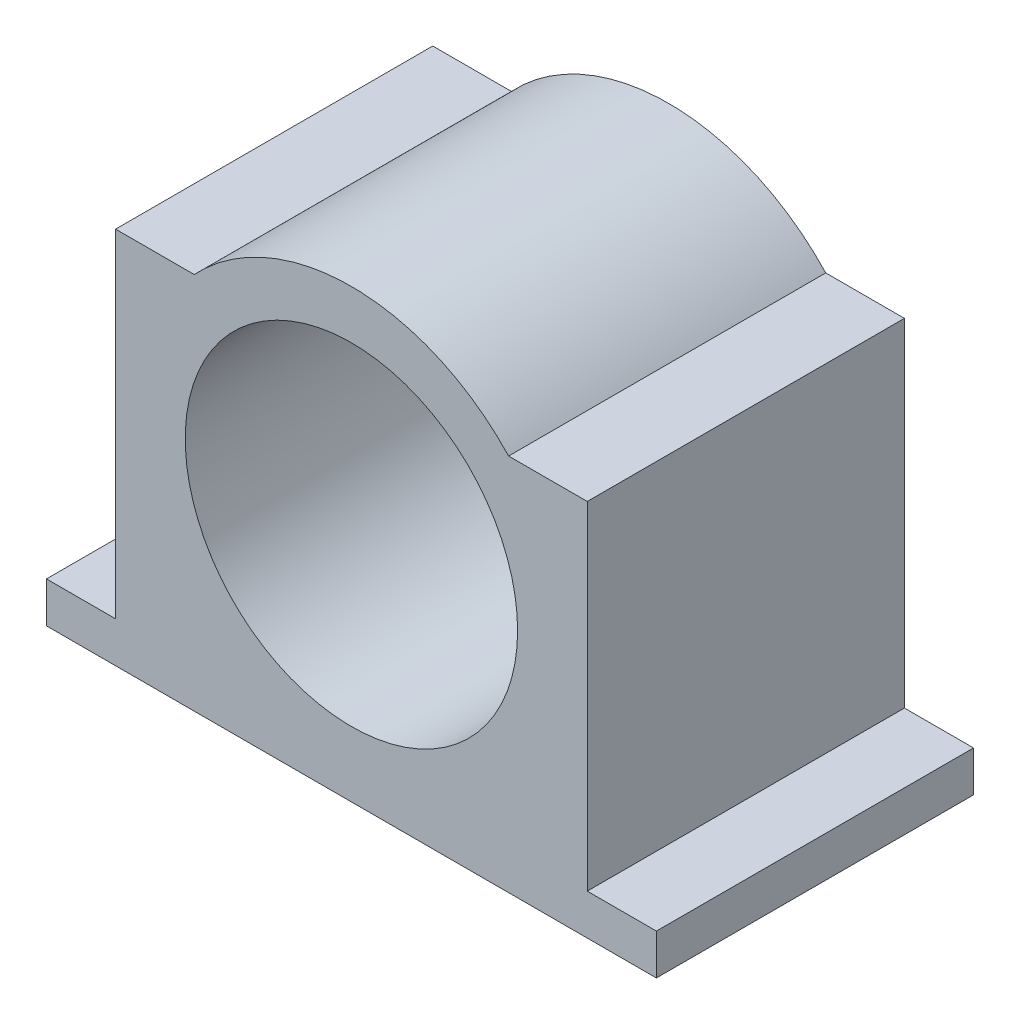
ISO-10303-21;
HEADER;
FILE_DESCRIPTION(('STEP AP214'),'2;1');
FILE_NAME('part.step','',(''),(''),'','','');
FILE_SCHEMA(('AUTOMOTIVE_DESIGN { 1 0 10303 214 1 1 1 1 }'));
ENDSEC;
DATA;
#1=APPLICATION_CONTEXT('core data for automotive mechanical design processes');
#2=APPLICATION_PROTOCOL_DEFINITION('international standard','automotive_design',2000,#1);
#3=PRODUCT_CONTEXT('',#1,'mechanical');
#4=PRODUCT('Part','Part','',(#3));
#5=PRODUCT_RELATED_PRODUCT_CATEGORY('part','',(#4));
#6=PRODUCT_DEFINITION_FORMATION('','',#4);
#7=PRODUCT_DEFINITION_CONTEXT('part definition',#1,'design');
#8=PRODUCT_DEFINITION('design','',#6,#7);
#9=PRODUCT_DEFINITION_SHAPE('','',#8);
#10=(LENGTH_UNIT() NAMED_UNIT(*) SI_UNIT(.MILLI.,.METRE.));
#11=(NAMED_UNIT(*) PLANE_ANGLE_UNIT() SI_UNIT($,.RADIAN.));
#12=(NAMED_UNIT(*) SI_UNIT($,.STERADIAN.) SOLID_ANGLE_UNIT());
#13=UNCERTAINTY_MEASURE_WITH_UNIT(LENGTH_MEASURE(1.E-05),#10,'distance_accuracy_value','');
#14=(GEOMETRIC_REPRESENTATION_CONTEXT(3) GLOBAL_UNCERTAINTY_ASSIGNED_CONTEXT((#13)) GLOBAL_UNIT_ASSIGNED_CONTEXT((#10,
#11,#12)) REPRESENTATION_CONTEXT('',''));
#15=CARTESIAN_POINT('',(0.,0.,0.));
#16=DIRECTION('',(0.,0.,1.));
#17=DIRECTION('',(1.,0.,0.));
#18=AXIS2_PLACEMENT_3D('',#15,#16,#17);
#19=CARTESIAN_POINT('',(75.,56.9226517561888,78.));
#20=DIRECTION('',(0.,0.,-1.));
#21=DIRECTION('',(-1.,0.,0.));
#22=AXIS2_PLACEMENT_3D('',#19,#20,#21);
#23=PLANE('',#22);
#24=DIRECTION('',(0.,-1.,0.));
#25=VECTOR('',#24,1.);
#26=CARTESIAN_POINT('',(0.,10.,78.));
#27=LINE('',#26,#25);
#28=CARTESIAN_POINT('',(0.,10.,78.));
#29=VERTEX_POINT('',#28);
#30=CARTESIAN_POINT('',(0.,0.,78.));
#31=VERTEX_POINT('',#30);
#32=EDGE_CURVE('E164',#29,#31,#27,.T.);
#33=ORIENTED_EDGE('',*,*,#32,.T.);
#34=DIRECTION('',(1.,0.,0.));
#35=VECTOR('',#34,1.);
#36=CARTESIAN_POINT('',(0.,0.,78.));
#37=LINE('',#36,#35);
#38=CARTESIAN_POINT('',(150.,0.,78.));
#39=VERTEX_POINT('',#38);
#40=EDGE_CURVE('E102',#31,#39,#37,.T.);
#41=ORIENTED_EDGE('',*,*,#40,.T.);
#42=DIRECTION('',(0.,1.,0.));
#43=VECTOR('',#42,1.);
#44=CARTESIAN_POINT('',(150.,0.,78.));
#45=LINE('',#44,#43);
#46=CARTESIAN_POINT('',(150.,9.99771395076202,78.));
#47=VERTEX_POINT('',#46);
#48=EDGE_CURVE('E185',#39,#47,#45,.T.);
#49=ORIENTED_EDGE('',*,*,#48,.T.);
#50=DIRECTION('',(-1.,0.,0.));
#51=VECTOR('',#50,1.);
#52=CARTESIAN_POINT('',(150.,9.99771395076202,78.));
#53=LINE('',#52,#51);
#54=CARTESIAN_POINT('',(133.,9.99771395076201,78.));
#55=VERTEX_POINT('',#54);
#56=EDGE_CURVE('E204',#47,#55,#53,.T.);
#57=ORIENTED_EDGE('',*,*,#56,.T.);
#58=DIRECTION('',(0.,1.,0.));
#59=VECTOR('',#58,1.);
#60=CARTESIAN_POINT('',(133.,9.99771395076201,78.));
#61=LINE('',#60,#59);
#62=CARTESIAN_POINT('',(133.,92.997713950762,78.));
#63=VERTEX_POINT('',#62);
#64=EDGE_CURVE('E201',#55,#63,#61,.T.);
#65=ORIENTED_EDGE('',*,*,#64,.T.);
#66=DIRECTION('',(-1.,0.,0.));
#67=VECTOR('',#66,1.);
#68=CARTESIAN_POINT('',(133.,92.997713950762,78.));
#69=LINE('',#68,#67);
#70=CARTESIAN_POINT('',(113.652787980268,92.997713950762,78.));
#71=VERTEX_POINT('',#70);
#72=EDGE_CURVE('E203',#63,#71,#69,.T.);
#73=ORIENTED_EDGE('',*,*,#72,.T.);
#74=CARTESIAN_POINT('',(75.,56.9226517561888,78.));
#75=DIRECTION('',(0.,0.,1.));
#76=DIRECTION('',(-1.,0.,0.));
#77=AXIS2_PLACEMENT_3D('',#74,#75,#76);
#78=CIRCLE('',#77,52.8719976073335);
#79=CARTESIAN_POINT('',(36.3493457405356,93.,78.));
#80=VERTEX_POINT('',#79);
#81=EDGE_CURVE('E127',#71,#80,#78,.T.);
#82=ORIENTED_EDGE('',*,*,#81,.T.);
#83=DIRECTION('',(-1.,0.,0.));
#84=VECTOR('',#83,1.);
#85=CARTESIAN_POINT('',(36.3493457405356,93.,78.));
#86=LINE('',#85,#84);
#87=CARTESIAN_POINT('',(17.,93.,78.));
#88=VERTEX_POINT('',#87);
#89=EDGE_CURVE('E121',#80,#88,#86,.T.);
#90=ORIENTED_EDGE('',*,*,#89,.T.);
#91=DIRECTION('',(0.,-1.,0.));
#92=VECTOR('',#91,1.);
#93=CARTESIAN_POINT('',(17.,93.,78.));
#94=LINE('',#93,#92);
#95=CARTESIAN_POINT('',(17.,10.,78.));
#96=VERTEX_POINT('',#95);
#97=EDGE_CURVE('E125',#88,#96,#94,.T.);
#98=ORIENTED_EDGE('',*,*,#97,.T.);
#99=DIRECTION('',(-1.,0.,0.));
#100=VECTOR('',#99,1.);
#101=CARTESIAN_POINT('',(17.,10.,78.));
#102=LINE('',#101,#100);
#103=EDGE_CURVE('E53',#96,#29,#102,.T.);
#104=ORIENTED_EDGE('',*,*,#103,.T.);
#105=EDGE_LOOP('',(#33,#41,#49,#57,#65,#73,#82,#90,#98,#104));
#106=FACE_BOUND('',#105,.T.);
#107=CARTESIAN_POINT('',(75.,56.9226517561888,78.));
#108=DIRECTION('',(0.,0.,1.));
#109=DIRECTION('',(1.,0.,0.));
#110=AXIS2_PLACEMENT_3D('',#107,#108,#109);
#111=CIRCLE('',#110,40.8719976073335);
#112=CARTESIAN_POINT('',(115.871997607334,56.9226517561888,78.));
#113=VERTEX_POINT('',#112);
#114=EDGE_CURVE('E149',#113,#113,#111,.T.);
#115=ORIENTED_EDGE('',*,*,#114,.F.);
#116=EDGE_LOOP('',(#115));
#117=FACE_BOUND('',#116,.T.);
#118=ADVANCED_FACE('F36',(#106,#117),#23,.F.);
#119=CARTESIAN_POINT('',(75.,56.9226517561888,0.));
#120=DIRECTION('',(0.,0.,-1.));
#121=DIRECTION('',(-1.,0.,0.));
#122=AXIS2_PLACEMENT_3D('',#119,#120,#121);
#123=PLANE('',#122);
#124=DIRECTION('',(0.,-1.,0.));
#125=VECTOR('',#124,1.);
#126=CARTESIAN_POINT('',(0.,10.,0.));
#127=LINE('',#126,#125);
#128=CARTESIAN_POINT('',(0.,10.,0.));
#129=VERTEX_POINT('',#128);
#130=CARTESIAN_POINT('',(0.,0.,0.));
#131=VERTEX_POINT('',#130);
#132=EDGE_CURVE('E145',#129,#131,#127,.T.);
#133=ORIENTED_EDGE('',*,*,#132,.F.);
#134=DIRECTION('',(-1.,0.,0.));
#135=VECTOR('',#134,1.);
#136=CARTESIAN_POINT('',(17.,10.,0.));
#137=LINE('',#136,#135);
#138=CARTESIAN_POINT('',(17.,10.,0.));
#139=VERTEX_POINT('',#138);
#140=EDGE_CURVE('E94',#139,#129,#137,.T.);
#141=ORIENTED_EDGE('',*,*,#140,.F.);
#142=DIRECTION('',(0.,-1.,0.));
#143=VECTOR('',#142,1.);
#144=CARTESIAN_POINT('',(17.,93.,0.));
#145=LINE('',#144,#143);
#146=CARTESIAN_POINT('',(17.,93.,0.));
#147=VERTEX_POINT('',#146);
#148=EDGE_CURVE('E88',#147,#139,#145,.T.);
#149=ORIENTED_EDGE('',*,*,#148,.F.);
#150=DIRECTION('',(-1.,0.,0.));
#151=VECTOR('',#150,1.);
#152=CARTESIAN_POINT('',(36.3493457405356,93.,0.));
#153=LINE('',#152,#151);
#154=CARTESIAN_POINT('',(36.3493457405356,93.,0.));
#155=VERTEX_POINT('',#154);
#156=EDGE_CURVE('E135',#155,#147,#153,.T.);
#157=ORIENTED_EDGE('',*,*,#156,.F.);
#158=CARTESIAN_POINT('',(75.,56.9226517561888,0.));
#159=DIRECTION('',(0.,0.,1.));
#160=DIRECTION('',(-1.,0.,0.));
#161=AXIS2_PLACEMENT_3D('',#158,#159,#160);
#162=CIRCLE('',#161,52.8719976073335);
#163=CARTESIAN_POINT('',(113.652787980268,92.997713950762,0.));
#164=VERTEX_POINT('',#163);
#165=EDGE_CURVE('E159',#164,#155,#162,.T.);
#166=ORIENTED_EDGE('',*,*,#165,.F.);
#167=DIRECTION('',(-1.,0.,0.));
#168=VECTOR('',#167,1.);
#169=CARTESIAN_POINT('',(133.,92.997713950762,0.));
#170=LINE('',#169,#168);
#171=CARTESIAN_POINT('',(133.,92.997713950762,0.));
#172=VERTEX_POINT('',#171);
#173=EDGE_CURVE('E157',#172,#164,#170,.T.);
#174=ORIENTED_EDGE('',*,*,#173,.F.);
#175=DIRECTION('',(0.,1.,0.));
#176=VECTOR('',#175,1.);
#177=CARTESIAN_POINT('',(133.,9.99771395076201,0.));
#178=LINE('',#177,#176);
#179=CARTESIAN_POINT('',(133.,9.99771395076201,0.));
#180=VERTEX_POINT('',#179);
#181=EDGE_CURVE('E155',#180,#172,#178,.T.);
#182=ORIENTED_EDGE('',*,*,#181,.F.);
#183=DIRECTION('',(-1.,0.,0.));
#184=VECTOR('',#183,1.);
#185=CARTESIAN_POINT('',(150.,9.99771395076202,0.));
#186=LINE('',#185,#184);
#187=CARTESIAN_POINT('',(150.,9.99771395076202,0.));
#188=VERTEX_POINT('',#187);
#189=EDGE_CURVE('E153',#188,#180,#186,.T.);
#190=ORIENTED_EDGE('',*,*,#189,.F.);
#191=DIRECTION('',(0.,1.,0.));
#192=VECTOR('',#191,1.);
#193=CARTESIAN_POINT('',(150.,0.,0.));
#194=LINE('',#193,#192);
#195=CARTESIAN_POINT('',(150.,0.,0.));
#196=VERTEX_POINT('',#195);
#197=EDGE_CURVE('E151',#196,#188,#194,.T.);
#198=ORIENTED_EDGE('',*,*,#197,.F.);
#199=DIRECTION('',(1.,0.,0.));
#200=VECTOR('',#199,1.);
#201=CARTESIAN_POINT('',(0.,0.,0.));
#202=LINE('',#201,#200);
#203=EDGE_CURVE('E148',#131,#196,#202,.T.);
#204=ORIENTED_EDGE('',*,*,#203,.F.);
#205=EDGE_LOOP('',(#133,#141,#149,#157,#166,#174,#182,#190,#198,#204));
#206=FACE_BOUND('',#205,.T.);
#207=CARTESIAN_POINT('',(75.,56.9226517561888,0.));
#208=DIRECTION('',(0.,0.,1.));
#209=DIRECTION('',(1.,0.,0.));
#210=AXIS2_PLACEMENT_3D('',#207,#208,#209);
#211=CIRCLE('',#210,40.8719976073335);
#212=CARTESIAN_POINT('',(115.871997607334,56.9226517561888,0.));
#213=VERTEX_POINT('',#212);
#214=EDGE_CURVE('E212',#213,#213,#211,.T.);
#215=ORIENTED_EDGE('',*,*,#214,.T.);
#216=EDGE_LOOP('',(#215));
#217=FACE_BOUND('',#216,.T.);
#218=ADVANCED_FACE('F189',(#206,#217),#123,.T.);
#219=CARTESIAN_POINT('',(0.,10.,78.));
#220=DIRECTION('',(1.,0.,0.));
#221=DIRECTION('',(0.,1.,0.));
#222=AXIS2_PLACEMENT_3D('',#219,#220,#221);
#223=PLANE('',#222);
#224=ORIENTED_EDGE('',*,*,#132,.T.);
#225=DIRECTION('',(0.,0.,-1.));
#226=VECTOR('',#225,1.);
#227=CARTESIAN_POINT('',(0.,0.,78.));
#228=LINE('',#227,#226);
#229=EDGE_CURVE('E11',#31,#131,#228,.T.);
#230=ORIENTED_EDGE('',*,*,#229,.F.);
#231=ORIENTED_EDGE('',*,*,#32,.F.);
#232=DIRECTION('',(0.,0.,-1.));
#233=VECTOR('',#232,1.);
#234=CARTESIAN_POINT('',(0.,10.,78.));
#235=LINE('',#234,#233);
#236=EDGE_CURVE('E141',#29,#129,#235,.T.);
#237=ORIENTED_EDGE('',*,*,#236,.T.);
#238=EDGE_LOOP('',(#224,#230,#231,#237));
#239=FACE_BOUND('',#238,.T.);
#240=ADVANCED_FACE('F38',(#239),#223,.F.);
#241=CARTESIAN_POINT('',(0.,0.,78.));
#242=DIRECTION('',(0.,1.,0.));
#243=DIRECTION('',(0.,0.,1.));
#244=AXIS2_PLACEMENT_3D('',#241,#242,#243);
#245=PLANE('',#244);
#246=ORIENTED_EDGE('',*,*,#203,.T.);
#247=DIRECTION('',(0.,0.,-1.));
#248=VECTOR('',#247,1.);
#249=CARTESIAN_POINT('',(150.,0.,78.));
#250=LINE('',#249,#248);
#251=EDGE_CURVE('E45',#39,#196,#250,.T.);
#252=ORIENTED_EDGE('',*,*,#251,.F.);
#253=ORIENTED_EDGE('',*,*,#40,.F.);
#254=ORIENTED_EDGE('',*,*,#229,.T.);
#255=EDGE_LOOP('',(#246,#252,#253,#254));
#256=FACE_BOUND('',#255,.T.);
#257=ADVANCED_FACE('F248',(#256),#245,.F.);
#258=CARTESIAN_POINT('',(150.,0.,78.));
#259=DIRECTION('',(-1.,0.,0.));
#260=DIRECTION('',(0.,0.,1.));
#261=AXIS2_PLACEMENT_3D('',#258,#259,#260);
#262=PLANE('',#261);
#263=ORIENTED_EDGE('',*,*,#197,.T.);
#264=DIRECTION('',(0.,0.,-1.));
#265=VECTOR('',#264,1.);
#266=CARTESIAN_POINT('',(150.,9.99771395076202,78.));
#267=LINE('',#266,#265);
#268=EDGE_CURVE('E177',#47,#188,#267,.T.);
#269=ORIENTED_EDGE('',*,*,#268,.F.);
#270=ORIENTED_EDGE('',*,*,#48,.F.);
#271=ORIENTED_EDGE('',*,*,#251,.T.);
#272=EDGE_LOOP('',(#263,#269,#270,#271));
#273=FACE_BOUND('',#272,.T.);
#274=ADVANCED_FACE('F183',(#273),#262,.F.);
#275=CARTESIAN_POINT('',(150.,9.99771395076202,78.));
#276=DIRECTION('',(0.,-1.,0.));
#277=DIRECTION('',(1.,0.,0.));
#278=AXIS2_PLACEMENT_3D('',#275,#276,#277);
#279=PLANE('',#278);
#280=ORIENTED_EDGE('',*,*,#189,.T.);
#281=DIRECTION('',(0.,0.,-1.));
#282=VECTOR('',#281,1.);
#283=CARTESIAN_POINT('',(133.,9.99771395076201,78.));
#284=LINE('',#283,#282);
#285=EDGE_CURVE('E174',#55,#180,#284,.T.);
#286=ORIENTED_EDGE('',*,*,#285,.F.);
#287=ORIENTED_EDGE('',*,*,#56,.F.);
#288=ORIENTED_EDGE('',*,*,#268,.T.);
#289=EDGE_LOOP('',(#280,#286,#287,#288));
#290=FACE_BOUND('',#289,.T.);
#291=ADVANCED_FACE('F195',(#290),#279,.F.);
#292=CARTESIAN_POINT('',(133.,9.99771395076201,78.));
#293=DIRECTION('',(-1.,0.,0.));
#294=DIRECTION('',(0.,0.,1.));
#295=AXIS2_PLACEMENT_3D('',#292,#293,#294);
#296=PLANE('',#295);
#297=ORIENTED_EDGE('',*,*,#181,.T.);
#298=DIRECTION('',(0.,0.,-1.));
#299=VECTOR('',#298,1.);
#300=CARTESIAN_POINT('',(133.,92.997713950762,78.));
#301=LINE('',#300,#299);
#302=EDGE_CURVE('E171',#63,#172,#301,.T.);
#303=ORIENTED_EDGE('',*,*,#302,.F.);
#304=ORIENTED_EDGE('',*,*,#64,.F.);
#305=ORIENTED_EDGE('',*,*,#285,.T.);
#306=EDGE_LOOP('',(#297,#303,#304,#305));
#307=FACE_BOUND('',#306,.T.);
#308=ADVANCED_FACE('F199',(#307),#296,.F.);
#309=CARTESIAN_POINT('',(133.,92.997713950762,78.));
#310=DIRECTION('',(0.,-1.,0.));
#311=DIRECTION('',(0.,0.,-1.));
#312=AXIS2_PLACEMENT_3D('',#309,#310,#311);
#313=PLANE('',#312);
#314=ORIENTED_EDGE('',*,*,#173,.T.);
#315=DIRECTION('',(0.,0.,-1.));
#316=VECTOR('',#315,1.);
#317=CARTESIAN_POINT('',(113.652787980268,92.997713950762,78.));
#318=LINE('',#317,#316);
#319=EDGE_CURVE('E168',#71,#164,#318,.T.);
#320=ORIENTED_EDGE('',*,*,#319,.F.);
#321=ORIENTED_EDGE('',*,*,#72,.F.);
#322=ORIENTED_EDGE('',*,*,#302,.T.);
#323=EDGE_LOOP('',(#314,#320,#321,#322));
#324=FACE_BOUND('',#323,.T.);
#325=ADVANCED_FACE('F238',(#324),#313,.F.);
#326=CARTESIAN_POINT('',(75.,56.9226517561888,78.));
#327=DIRECTION('',(0.,0.,-1.));
#328=DIRECTION('',(-1.,0.,0.));
#329=AXIS2_PLACEMENT_3D('',#326,#327,#328);
#330=CYLINDRICAL_SURFACE('',#329,52.8719976073335);
#331=ORIENTED_EDGE('',*,*,#165,.T.);
#332=DIRECTION('',(0.,0.,-1.));
#333=VECTOR('',#332,1.);
#334=CARTESIAN_POINT('',(36.3493457405356,93.,78.));
#335=LINE('',#334,#333);
#336=EDGE_CURVE('E136',#80,#155,#335,.T.);
#337=ORIENTED_EDGE('',*,*,#336,.F.);
#338=ORIENTED_EDGE('',*,*,#81,.F.);
#339=ORIENTED_EDGE('',*,*,#319,.T.);
#340=EDGE_LOOP('',(#331,#337,#338,#339));
#341=FACE_BOUND('',#340,.T.);
#342=ADVANCED_FACE('F235',(#341),#330,.T.);
#343=CARTESIAN_POINT('',(36.3493457405356,93.,78.));
#344=DIRECTION('',(0.,-1.,0.));
#345=DIRECTION('',(0.,0.,-1.));
#346=AXIS2_PLACEMENT_3D('',#343,#344,#345);
#347=PLANE('',#346);
#348=ORIENTED_EDGE('',*,*,#156,.T.);
#349=DIRECTION('',(0.,0.,-1.));
#350=VECTOR('',#349,1.);
#351=CARTESIAN_POINT('',(17.,93.,78.));
#352=LINE('',#351,#350);
#353=EDGE_CURVE('E132',#88,#147,#352,.T.);
#354=ORIENTED_EDGE('',*,*,#353,.F.);
#355=ORIENTED_EDGE('',*,*,#89,.F.);
#356=ORIENTED_EDGE('',*,*,#336,.T.);
#357=EDGE_LOOP('',(#348,#354,#355,#356));
#358=FACE_BOUND('',#357,.T.);
#359=ADVANCED_FACE('F133',(#358),#347,.F.);
#360=CARTESIAN_POINT('',(17.,93.,78.));
#361=DIRECTION('',(1.,0.,0.));
#362=DIRECTION('',(0.,1.,0.));
#363=AXIS2_PLACEMENT_3D('',#360,#361,#362);
#364=PLANE('',#363);
#365=ORIENTED_EDGE('',*,*,#148,.T.);
#366=DIRECTION('',(0.,0.,-1.));
#367=VECTOR('',#366,1.);
#368=CARTESIAN_POINT('',(17.,10.,78.));
#369=LINE('',#368,#367);
#370=EDGE_CURVE('E137',#96,#139,#369,.T.);
#371=ORIENTED_EDGE('',*,*,#370,.F.);
#372=ORIENTED_EDGE('',*,*,#97,.F.);
#373=ORIENTED_EDGE('',*,*,#353,.T.);
#374=EDGE_LOOP('',(#365,#371,#372,#373));
#375=FACE_BOUND('',#374,.T.);
#376=ADVANCED_FACE('F139',(#375),#364,.F.);
#377=CARTESIAN_POINT('',(17.,10.,78.));
#378=DIRECTION('',(0.,-1.,0.));
#379=DIRECTION('',(1.,0.,0.));
#380=AXIS2_PLACEMENT_3D('',#377,#378,#379);
#381=PLANE('',#380);
#382=ORIENTED_EDGE('',*,*,#140,.T.);
#383=ORIENTED_EDGE('',*,*,#236,.F.);
#384=ORIENTED_EDGE('',*,*,#103,.F.);
#385=ORIENTED_EDGE('',*,*,#370,.T.);
#386=EDGE_LOOP('',(#382,#383,#384,#385));
#387=FACE_BOUND('',#386,.T.);
#388=ADVANCED_FACE('F228',(#387),#381,.F.);
#389=CARTESIAN_POINT('',(75.,56.9226517561888,78.));
#390=DIRECTION('',(0.,0.,-1.));
#391=DIRECTION('',(-1.,0.,0.));
#392=AXIS2_PLACEMENT_3D('',#389,#390,#391);
#393=CYLINDRICAL_SURFACE('',#392,40.8719976073335);
#394=ORIENTED_EDGE('',*,*,#114,.T.);
#395=EDGE_LOOP('',(#394));
#396=FACE_BOUND('',#395,.T.);
#397=ORIENTED_EDGE('',*,*,#214,.F.);
#398=EDGE_LOOP('',(#397));
#399=FACE_BOUND('',#398,.T.);
#400=ADVANCED_FACE('F218',(#396,#399),#393,.F.);
#401=CLOSED_SHELL('',(#118,#218,#240,#257,#274,#291,#308,#325,#342,#359,#376,#388,#400));
#402=MANIFOLD_SOLID_BREP('B2',#401);
#403=ADVANCED_BREP_SHAPE_REPRESENTATION('',(#18,#402),#14);
#404=SHAPE_DEFINITION_REPRESENTATION(#9,#403);
ENDSEC;
END-ISO-10303-21;
